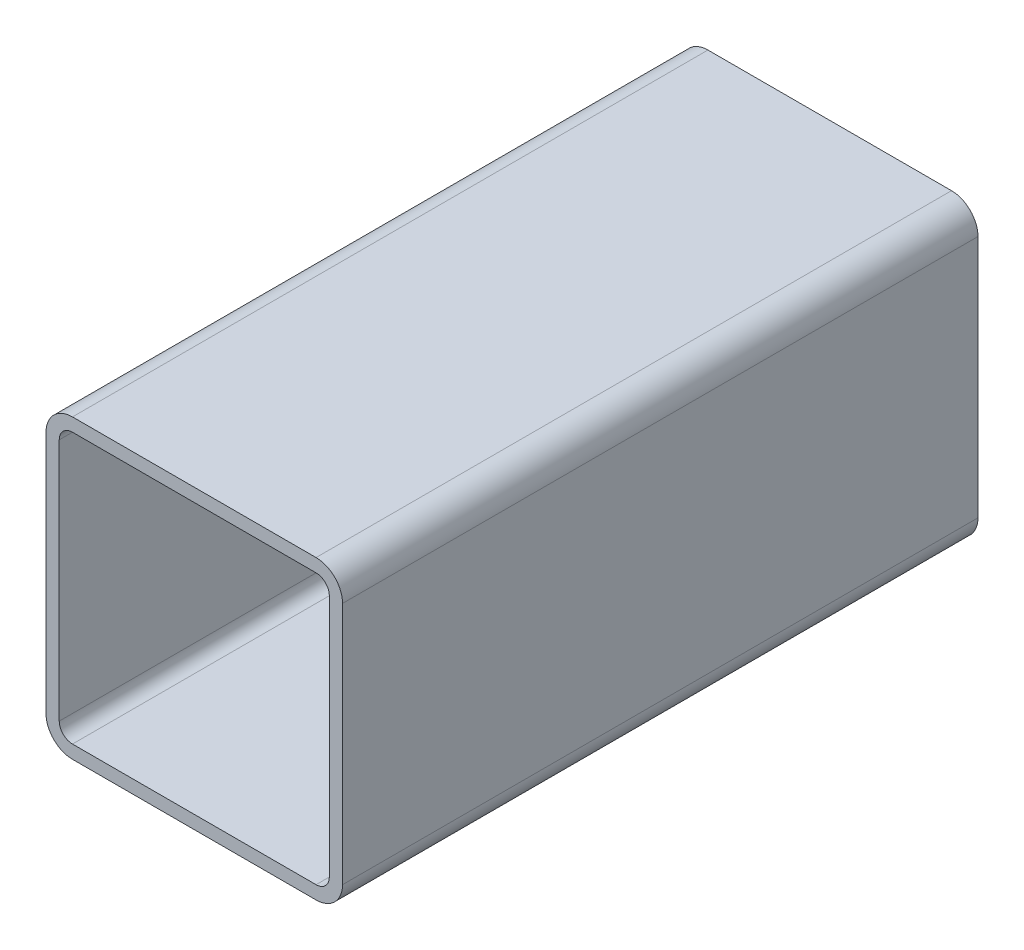
ISO-10303-21;
HEADER;
FILE_DESCRIPTION(('STEP AP214'),'2;1');
FILE_NAME('part.step','',(''),(''),'','','');
FILE_SCHEMA(('AUTOMOTIVE_DESIGN { 1 0 10303 214 1 1 1 1 }'));
ENDSEC;
DATA;
#1=APPLICATION_CONTEXT('core data for automotive mechanical design processes');
#2=APPLICATION_PROTOCOL_DEFINITION('international standard','automotive_design',2000,#1);
#3=PRODUCT_CONTEXT('',#1,'mechanical');
#4=PRODUCT('Part','Part','',(#3));
#5=PRODUCT_RELATED_PRODUCT_CATEGORY('part','',(#4));
#6=PRODUCT_DEFINITION_FORMATION('','',#4);
#7=PRODUCT_DEFINITION_CONTEXT('part definition',#1,'design');
#8=PRODUCT_DEFINITION('design','',#6,#7);
#9=PRODUCT_DEFINITION_SHAPE('','',#8);
#10=(LENGTH_UNIT() NAMED_UNIT(*) SI_UNIT(.MILLI.,.METRE.));
#11=(NAMED_UNIT(*) PLANE_ANGLE_UNIT() SI_UNIT($,.RADIAN.));
#12=(NAMED_UNIT(*) SI_UNIT($,.STERADIAN.) SOLID_ANGLE_UNIT());
#13=UNCERTAINTY_MEASURE_WITH_UNIT(LENGTH_MEASURE(1.E-05),#10,'distance_accuracy_value','');
#14=(GEOMETRIC_REPRESENTATION_CONTEXT(3) GLOBAL_UNCERTAINTY_ASSIGNED_CONTEXT((#13)) GLOBAL_UNIT_ASSIGNED_CONTEXT((#10,
#11,#12)) REPRESENTATION_CONTEXT('',''));
#15=CARTESIAN_POINT('',(0.,0.,0.));
#16=DIRECTION('',(0.,0.,1.));
#17=DIRECTION('',(1.,0.,0.));
#18=AXIS2_PLACEMENT_3D('',#15,#16,#17);
#19=CARTESIAN_POINT('',(6.35000000000004,0.,2070.1));
#20=DIRECTION('',(0.,1.,0.));
#21=DIRECTION('',(0.,0.,1.));
#22=AXIS2_PLACEMENT_3D('',#19,#20,#21);
#23=PLANE('',#22);
#24=DIRECTION('',(0.,0.,-1.));
#25=VECTOR('',#24,1.);
#26=CARTESIAN_POINT('',(6.35000000000004,0.,2070.1));
#27=LINE('',#26,#25);
#28=CARTESIAN_POINT('',(6.35000000000004,0.,2070.1));
#29=VERTEX_POINT('',#28);
#30=CARTESIAN_POINT('',(6.35000000000005,0.,1917.7));
#31=VERTEX_POINT('',#30);
#32=EDGE_CURVE('E42',#29,#31,#27,.T.);
#33=ORIENTED_EDGE('',*,*,#32,.T.);
#34=DIRECTION('',(-1.,0.,0.));
#35=VECTOR('',#34,1.);
#36=CARTESIAN_POINT('',(64.77,0.,1917.7));
#37=LINE('',#36,#35);
#38=CARTESIAN_POINT('',(64.77,0.,1917.7));
#39=VERTEX_POINT('',#38);
#40=EDGE_CURVE('E188',#39,#31,#37,.T.);
#41=ORIENTED_EDGE('',*,*,#40,.F.);
#42=DIRECTION('',(0.,0.,-1.));
#43=VECTOR('',#42,1.);
#44=CARTESIAN_POINT('',(64.77,0.,2070.1));
#45=LINE('',#44,#43);
#46=CARTESIAN_POINT('',(64.77,0.,2070.1));
#47=VERTEX_POINT('',#46);
#48=EDGE_CURVE('E181',#47,#39,#45,.T.);
#49=ORIENTED_EDGE('',*,*,#48,.F.);
#50=DIRECTION('',(1.,0.,0.));
#51=VECTOR('',#50,1.);
#52=CARTESIAN_POINT('',(6.35000000000004,0.,2070.1));
#53=LINE('',#52,#51);
#54=EDGE_CURVE('E189',#29,#47,#53,.T.);
#55=ORIENTED_EDGE('',*,*,#54,.F.);
#56=EDGE_LOOP('',(#33,#41,#49,#55));
#57=FACE_BOUND('',#56,.T.);
#58=ADVANCED_FACE('F34',(#57),#23,.F.);
#59=CARTESIAN_POINT('',(6.35,71.12,2070.1));
#60=DIRECTION('',(0.,-1.,0.));
#61=DIRECTION('',(0.,0.,-1.));
#62=AXIS2_PLACEMENT_3D('',#59,#60,#61);
#63=PLANE('',#62);
#64=DIRECTION('',(0.,0.,-1.));
#65=VECTOR('',#64,1.);
#66=CARTESIAN_POINT('',(64.77,71.12,2070.1));
#67=LINE('',#66,#65);
#68=CARTESIAN_POINT('',(64.77,71.12,2070.1));
#69=VERTEX_POINT('',#68);
#70=CARTESIAN_POINT('',(64.77,71.12,1917.7));
#71=VERTEX_POINT('',#70);
#72=EDGE_CURVE('E168',#69,#71,#67,.T.);
#73=ORIENTED_EDGE('',*,*,#72,.T.);
#74=DIRECTION('',(1.,0.,0.));
#75=VECTOR('',#74,1.);
#76=CARTESIAN_POINT('',(6.35,71.12,1917.7));
#77=LINE('',#76,#75);
#78=CARTESIAN_POINT('',(6.35,71.12,1917.7));
#79=VERTEX_POINT('',#78);
#80=EDGE_CURVE('E162',#79,#71,#77,.T.);
#81=ORIENTED_EDGE('',*,*,#80,.F.);
#82=DIRECTION('',(0.,0.,-1.));
#83=VECTOR('',#82,1.);
#84=CARTESIAN_POINT('',(6.35,71.12,2070.1));
#85=LINE('',#84,#83);
#86=CARTESIAN_POINT('',(6.35,71.12,2070.1));
#87=VERTEX_POINT('',#86);
#88=EDGE_CURVE('E161',#87,#79,#85,.T.);
#89=ORIENTED_EDGE('',*,*,#88,.F.);
#90=DIRECTION('',(-1.,0.,0.));
#91=VECTOR('',#90,1.);
#92=CARTESIAN_POINT('',(6.35,71.12,2070.1));
#93=LINE('',#92,#91);
#94=EDGE_CURVE('E266',#69,#87,#93,.T.);
#95=ORIENTED_EDGE('',*,*,#94,.F.);
#96=EDGE_LOOP('',(#73,#81,#89,#95));
#97=FACE_BOUND('',#96,.T.);
#98=ADVANCED_FACE('F276',(#97),#63,.F.);
#99=CARTESIAN_POINT('',(6.35000000000004,3.175,2070.1));
#100=DIRECTION('',(0.,1.,0.));
#101=DIRECTION('',(0.,0.,1.));
#102=AXIS2_PLACEMENT_3D('',#99,#100,#101);
#103=PLANE('',#102);
#104=DIRECTION('',(1.,0.,0.));
#105=VECTOR('',#104,1.);
#106=CARTESIAN_POINT('',(6.35000000000004,3.175,1917.7));
#107=LINE('',#106,#105);
#108=CARTESIAN_POINT('',(6.35000000000004,3.175,1917.7));
#109=VERTEX_POINT('',#108);
#110=CARTESIAN_POINT('',(64.77,3.175,1917.7));
#111=VERTEX_POINT('',#110);
#112=EDGE_CURVE('E209',#109,#111,#107,.T.);
#113=ORIENTED_EDGE('',*,*,#112,.F.);
#114=DIRECTION('',(0.,0.,-1.));
#115=VECTOR('',#114,1.);
#116=CARTESIAN_POINT('',(6.35000000000004,3.175,2070.1));
#117=LINE('',#116,#115);
#118=CARTESIAN_POINT('',(6.35000000000004,3.175,2070.1));
#119=VERTEX_POINT('',#118);
#120=EDGE_CURVE('E255',#119,#109,#117,.T.);
#121=ORIENTED_EDGE('',*,*,#120,.F.);
#122=DIRECTION('',(1.,0.,0.));
#123=VECTOR('',#122,1.);
#124=CARTESIAN_POINT('',(6.35000000000004,3.175,2070.1));
#125=LINE('',#124,#123);
#126=CARTESIAN_POINT('',(64.77,3.175,2070.1));
#127=VERTEX_POINT('',#126);
#128=EDGE_CURVE('E219',#119,#127,#125,.T.);
#129=ORIENTED_EDGE('',*,*,#128,.T.);
#130=DIRECTION('',(0.,0.,-1.));
#131=VECTOR('',#130,1.);
#132=CARTESIAN_POINT('',(64.77,3.175,2070.1));
#133=LINE('',#132,#131);
#134=EDGE_CURVE('E252',#127,#111,#133,.T.);
#135=ORIENTED_EDGE('',*,*,#134,.T.);
#136=EDGE_LOOP('',(#113,#121,#129,#135));
#137=FACE_BOUND('',#136,.T.);
#138=ADVANCED_FACE('F301',(#137),#103,.T.);
#139=CARTESIAN_POINT('',(6.35,67.945,2070.1));
#140=DIRECTION('',(0.,-1.,0.));
#141=DIRECTION('',(0.,0.,-1.));
#142=AXIS2_PLACEMENT_3D('',#139,#140,#141);
#143=PLANE('',#142);
#144=DIRECTION('',(-1.,0.,0.));
#145=VECTOR('',#144,1.);
#146=CARTESIAN_POINT('',(6.35,67.945,1917.7));
#147=LINE('',#146,#145);
#148=CARTESIAN_POINT('',(64.77,67.945,1917.7));
#149=VERTEX_POINT('',#148);
#150=CARTESIAN_POINT('',(6.35,67.945,1917.7));
#151=VERTEX_POINT('',#150);
#152=EDGE_CURVE('E207',#149,#151,#147,.T.);
#153=ORIENTED_EDGE('',*,*,#152,.F.);
#154=DIRECTION('',(0.,0.,-1.));
#155=VECTOR('',#154,1.);
#156=CARTESIAN_POINT('',(64.77,67.945,2070.1));
#157=LINE('',#156,#155);
#158=CARTESIAN_POINT('',(64.77,67.945,2070.1));
#159=VERTEX_POINT('',#158);
#160=EDGE_CURVE('E243',#159,#149,#157,.T.);
#161=ORIENTED_EDGE('',*,*,#160,.F.);
#162=DIRECTION('',(-1.,0.,0.));
#163=VECTOR('',#162,1.);
#164=CARTESIAN_POINT('',(6.35,67.945,2070.1));
#165=LINE('',#164,#163);
#166=CARTESIAN_POINT('',(6.35,67.945,2070.1));
#167=VERTEX_POINT('',#166);
#168=EDGE_CURVE('E227',#159,#167,#165,.T.);
#169=ORIENTED_EDGE('',*,*,#168,.T.);
#170=DIRECTION('',(0.,0.,-1.));
#171=VECTOR('',#170,1.);
#172=CARTESIAN_POINT('',(6.35,67.945,2070.1));
#173=LINE('',#172,#171);
#174=EDGE_CURVE('E240',#167,#151,#173,.T.);
#175=ORIENTED_EDGE('',*,*,#174,.T.);
#176=EDGE_LOOP('',(#153,#161,#169,#175));
#177=FACE_BOUND('',#176,.T.);
#178=ADVANCED_FACE('F306',(#177),#143,.T.);
#179=CARTESIAN_POINT('',(6.35,6.35,2070.1));
#180=DIRECTION('',(0.,0.,1.));
#181=DIRECTION('',(1.,0.,0.));
#182=AXIS2_PLACEMENT_3D('',#179,#180,#181);
#183=PLANE('',#182);
#184=CARTESIAN_POINT('',(6.35,6.35,2070.1));
#185=DIRECTION('',(0.,0.,1.));
#186=DIRECTION('',(1.,0.,0.));
#187=AXIS2_PLACEMENT_3D('',#184,#185,#186);
#188=CIRCLE('',#187,6.35);
#189=CARTESIAN_POINT('',(0.,6.35000000000004,2070.1));
#190=VERTEX_POINT('',#189);
#191=EDGE_CURVE('E193',#190,#29,#188,.T.);
#192=ORIENTED_EDGE('',*,*,#191,.T.);
#193=ORIENTED_EDGE('',*,*,#54,.T.);
#194=CARTESIAN_POINT('',(64.77,6.35,2070.1));
#195=DIRECTION('',(0.,0.,1.));
#196=DIRECTION('',(1.,0.,0.));
#197=AXIS2_PLACEMENT_3D('',#194,#195,#196);
#198=CIRCLE('',#197,6.35);
#199=CARTESIAN_POINT('',(71.12,6.35,2070.1));
#200=VERTEX_POINT('',#199);
#201=EDGE_CURVE('E260',#47,#200,#198,.T.);
#202=ORIENTED_EDGE('',*,*,#201,.T.);
#203=DIRECTION('',(0.,1.,0.));
#204=VECTOR('',#203,1.);
#205=CARTESIAN_POINT('',(71.12,6.35,2070.1));
#206=LINE('',#205,#204);
#207=CARTESIAN_POINT('',(71.12,64.77,2070.1));
#208=VERTEX_POINT('',#207);
#209=EDGE_CURVE('E262',#200,#208,#206,.T.);
#210=ORIENTED_EDGE('',*,*,#209,.T.);
#211=CARTESIAN_POINT('',(64.77,64.77,2070.1));
#212=DIRECTION('',(0.,0.,1.));
#213=DIRECTION('',(1.,0.,0.));
#214=AXIS2_PLACEMENT_3D('',#211,#212,#213);
#215=CIRCLE('',#214,6.34999999999999);
#216=EDGE_CURVE('E264',#208,#69,#215,.T.);
#217=ORIENTED_EDGE('',*,*,#216,.T.);
#218=ORIENTED_EDGE('',*,*,#94,.T.);
#219=CARTESIAN_POINT('',(6.35,64.77,2070.1));
#220=DIRECTION('',(0.,0.,1.));
#221=DIRECTION('',(1.,0.,0.));
#222=AXIS2_PLACEMENT_3D('',#219,#220,#221);
#223=CIRCLE('',#222,6.35);
#224=CARTESIAN_POINT('',(0.,64.77,2070.1));
#225=VERTEX_POINT('',#224);
#226=EDGE_CURVE('E268',#87,#225,#223,.T.);
#227=ORIENTED_EDGE('',*,*,#226,.T.);
#228=DIRECTION('',(0.,-1.,0.));
#229=VECTOR('',#228,1.);
#230=CARTESIAN_POINT('',(0.,6.35000000000004,2070.1));
#231=LINE('',#230,#229);
#232=EDGE_CURVE('E165',#225,#190,#231,.T.);
#233=ORIENTED_EDGE('',*,*,#232,.T.);
#234=EDGE_LOOP('',(#192,#193,#202,#210,#217,#218,#227,#233));
#235=FACE_BOUND('',#234,.T.);
#236=ORIENTED_EDGE('',*,*,#128,.F.);
#237=CARTESIAN_POINT('',(6.35,6.35,2070.1));
#238=DIRECTION('',(0.,0.,1.));
#239=DIRECTION('',(1.,0.,0.));
#240=AXIS2_PLACEMENT_3D('',#237,#238,#239);
#241=CIRCLE('',#240,3.175);
#242=CARTESIAN_POINT('',(3.175,6.35000000000004,2070.1));
#243=VERTEX_POINT('',#242);
#244=EDGE_CURVE('E217',#243,#119,#241,.T.);
#245=ORIENTED_EDGE('',*,*,#244,.F.);
#246=DIRECTION('',(0.,-1.,0.));
#247=VECTOR('',#246,1.);
#248=CARTESIAN_POINT('',(3.175,6.35000000000004,2070.1));
#249=LINE('',#248,#247);
#250=CARTESIAN_POINT('',(3.175,64.77,2070.1));
#251=VERTEX_POINT('',#250);
#252=EDGE_CURVE('E232',#251,#243,#249,.T.);
#253=ORIENTED_EDGE('',*,*,#252,.F.);
#254=CARTESIAN_POINT('',(6.35,64.77,2070.1));
#255=DIRECTION('',(0.,0.,1.));
#256=DIRECTION('',(1.,0.,0.));
#257=AXIS2_PLACEMENT_3D('',#254,#255,#256);
#258=CIRCLE('',#257,3.175);
#259=EDGE_CURVE('E229',#167,#251,#258,.T.);
#260=ORIENTED_EDGE('',*,*,#259,.F.);
#261=ORIENTED_EDGE('',*,*,#168,.F.);
#262=CARTESIAN_POINT('',(64.77,64.77,2070.1));
#263=DIRECTION('',(0.,0.,1.));
#264=DIRECTION('',(1.,0.,0.));
#265=AXIS2_PLACEMENT_3D('',#262,#263,#264);
#266=CIRCLE('',#265,3.175);
#267=CARTESIAN_POINT('',(67.945,64.77,2070.1));
#268=VERTEX_POINT('',#267);
#269=EDGE_CURVE('E225',#268,#159,#266,.T.);
#270=ORIENTED_EDGE('',*,*,#269,.F.);
#271=DIRECTION('',(0.,1.,0.));
#272=VECTOR('',#271,1.);
#273=CARTESIAN_POINT('',(67.945,6.35,2070.1));
#274=LINE('',#273,#272);
#275=CARTESIAN_POINT('',(67.945,6.35,2070.1));
#276=VERTEX_POINT('',#275);
#277=EDGE_CURVE('E223',#276,#268,#274,.T.);
#278=ORIENTED_EDGE('',*,*,#277,.F.);
#279=CARTESIAN_POINT('',(64.77,6.35,2070.1));
#280=DIRECTION('',(0.,0.,1.));
#281=DIRECTION('',(1.,0.,0.));
#282=AXIS2_PLACEMENT_3D('',#279,#280,#281);
#283=CIRCLE('',#282,3.175);
#284=EDGE_CURVE('E221',#127,#276,#283,.T.);
#285=ORIENTED_EDGE('',*,*,#284,.F.);
#286=EDGE_LOOP('',(#236,#245,#253,#260,#261,#270,#278,#285));
#287=FACE_BOUND('',#286,.T.);
#288=ADVANCED_FACE('F270',(#235,#287),#183,.T.);
#289=CARTESIAN_POINT('',(6.35,6.35,2070.1));
#290=DIRECTION('',(0.,0.,-1.));
#291=DIRECTION('',(-1.,0.,0.));
#292=AXIS2_PLACEMENT_3D('',#289,#290,#291);
#293=CYLINDRICAL_SURFACE('',#292,6.35);
#294=DIRECTION('',(0.,0.,-1.));
#295=VECTOR('',#294,1.);
#296=CARTESIAN_POINT('',(0.,6.35000000000004,2070.1));
#297=LINE('',#296,#295);
#298=CARTESIAN_POINT('',(0.,6.35000000000004,1917.7));
#299=VERTEX_POINT('',#298);
#300=EDGE_CURVE('E166',#190,#299,#297,.T.);
#301=ORIENTED_EDGE('',*,*,#300,.T.);
#302=CARTESIAN_POINT('',(6.35,6.35,1917.7));
#303=DIRECTION('',(0.,0.,1.));
#304=DIRECTION('',(1.,0.,0.));
#305=AXIS2_PLACEMENT_3D('',#302,#303,#304);
#306=CIRCLE('',#305,6.35);
#307=EDGE_CURVE('E49',#31,#299,#306,.F.);
#308=ORIENTED_EDGE('',*,*,#307,.F.);
#309=ORIENTED_EDGE('',*,*,#32,.F.);
#310=ORIENTED_EDGE('',*,*,#191,.F.);
#311=EDGE_LOOP('',(#301,#308,#309,#310));
#312=FACE_BOUND('',#311,.T.);
#313=ADVANCED_FACE('F36',(#312),#293,.T.);
#314=CARTESIAN_POINT('',(64.77,6.35,2070.1));
#315=DIRECTION('',(0.,0.,-1.));
#316=DIRECTION('',(-1.,0.,0.));
#317=AXIS2_PLACEMENT_3D('',#314,#315,#316);
#318=CYLINDRICAL_SURFACE('',#317,6.35);
#319=ORIENTED_EDGE('',*,*,#48,.T.);
#320=CARTESIAN_POINT('',(64.77,6.35,1917.7));
#321=DIRECTION('',(0.,0.,1.));
#322=DIRECTION('',(1.,0.,0.));
#323=AXIS2_PLACEMENT_3D('',#320,#321,#322);
#324=CIRCLE('',#323,6.35);
#325=CARTESIAN_POINT('',(71.12,6.35,1917.7));
#326=VERTEX_POINT('',#325);
#327=EDGE_CURVE('E197',#326,#39,#324,.F.);
#328=ORIENTED_EDGE('',*,*,#327,.F.);
#329=DIRECTION('',(0.,0.,-1.));
#330=VECTOR('',#329,1.);
#331=CARTESIAN_POINT('',(71.12,6.35,2070.1));
#332=LINE('',#331,#330);
#333=EDGE_CURVE('E178',#200,#326,#332,.T.);
#334=ORIENTED_EDGE('',*,*,#333,.F.);
#335=ORIENTED_EDGE('',*,*,#201,.F.);
#336=EDGE_LOOP('',(#319,#328,#334,#335));
#337=FACE_BOUND('',#336,.T.);
#338=ADVANCED_FACE('F288',(#337),#318,.T.);
#339=CARTESIAN_POINT('',(71.12,6.35,2070.1));
#340=DIRECTION('',(-1.,0.,0.));
#341=DIRECTION('',(0.,0.,1.));
#342=AXIS2_PLACEMENT_3D('',#339,#340,#341);
#343=PLANE('',#342);
#344=ORIENTED_EDGE('',*,*,#333,.T.);
#345=DIRECTION('',(0.,-1.,0.));
#346=VECTOR('',#345,1.);
#347=CARTESIAN_POINT('',(71.12,64.77,1917.7));
#348=LINE('',#347,#346);
#349=CARTESIAN_POINT('',(71.12,64.77,1917.7));
#350=VERTEX_POINT('',#349);
#351=EDGE_CURVE('E201',#350,#326,#348,.T.);
#352=ORIENTED_EDGE('',*,*,#351,.F.);
#353=DIRECTION('',(0.,0.,-1.));
#354=VECTOR('',#353,1.);
#355=CARTESIAN_POINT('',(71.12,64.77,2070.1));
#356=LINE('',#355,#354);
#357=EDGE_CURVE('E175',#208,#350,#356,.T.);
#358=ORIENTED_EDGE('',*,*,#357,.F.);
#359=ORIENTED_EDGE('',*,*,#209,.F.);
#360=EDGE_LOOP('',(#344,#352,#358,#359));
#361=FACE_BOUND('',#360,.T.);
#362=ADVANCED_FACE('F284',(#361),#343,.F.);
#363=CARTESIAN_POINT('',(64.77,64.77,2070.1));
#364=DIRECTION('',(0.,0.,-1.));
#365=DIRECTION('',(-1.,0.,0.));
#366=AXIS2_PLACEMENT_3D('',#363,#364,#365);
#367=CYLINDRICAL_SURFACE('',#366,6.34999999999999);
#368=ORIENTED_EDGE('',*,*,#357,.T.);
#369=CARTESIAN_POINT('',(64.77,64.77,1917.7));
#370=DIRECTION('',(0.,0.,1.));
#371=DIRECTION('',(1.,0.,0.));
#372=AXIS2_PLACEMENT_3D('',#369,#370,#371);
#373=CIRCLE('',#372,6.34999999999999);
#374=EDGE_CURVE('E203',#71,#350,#373,.F.);
#375=ORIENTED_EDGE('',*,*,#374,.F.);
#376=ORIENTED_EDGE('',*,*,#72,.F.);
#377=ORIENTED_EDGE('',*,*,#216,.F.);
#378=EDGE_LOOP('',(#368,#375,#376,#377));
#379=FACE_BOUND('',#378,.T.);
#380=ADVANCED_FACE('F280',(#379),#367,.T.);
#381=CARTESIAN_POINT('',(6.35,64.77,2070.1));
#382=DIRECTION('',(0.,0.,-1.));
#383=DIRECTION('',(-1.,0.,0.));
#384=AXIS2_PLACEMENT_3D('',#381,#382,#383);
#385=CYLINDRICAL_SURFACE('',#384,6.35);
#386=ORIENTED_EDGE('',*,*,#88,.T.);
#387=CARTESIAN_POINT('',(6.35,64.77,1917.7));
#388=DIRECTION('',(0.,0.,1.));
#389=DIRECTION('',(1.,0.,0.));
#390=AXIS2_PLACEMENT_3D('',#387,#388,#389);
#391=CIRCLE('',#390,6.35);
#392=CARTESIAN_POINT('',(0.,64.77,1917.7));
#393=VERTEX_POINT('',#392);
#394=EDGE_CURVE('E146',#393,#79,#391,.F.);
#395=ORIENTED_EDGE('',*,*,#394,.F.);
#396=DIRECTION('',(0.,0.,-1.));
#397=VECTOR('',#396,1.);
#398=CARTESIAN_POINT('',(0.,64.77,2070.1));
#399=LINE('',#398,#397);
#400=EDGE_CURVE('E158',#225,#393,#399,.T.);
#401=ORIENTED_EDGE('',*,*,#400,.F.);
#402=ORIENTED_EDGE('',*,*,#226,.F.);
#403=EDGE_LOOP('',(#386,#395,#401,#402));
#404=FACE_BOUND('',#403,.T.);
#405=ADVANCED_FACE('F156',(#404),#385,.T.);
#406=CARTESIAN_POINT('',(0.,6.35000000000004,2070.1));
#407=DIRECTION('',(1.,0.,0.));
#408=DIRECTION('',(0.,0.,-1.));
#409=AXIS2_PLACEMENT_3D('',#406,#407,#408);
#410=PLANE('',#409);
#411=ORIENTED_EDGE('',*,*,#400,.T.);
#412=DIRECTION('',(0.,1.,0.));
#413=VECTOR('',#412,1.);
#414=CARTESIAN_POINT('',(0.,6.35000000000004,1917.7));
#415=LINE('',#414,#413);
#416=EDGE_CURVE('E143',#299,#393,#415,.T.);
#417=ORIENTED_EDGE('',*,*,#416,.F.);
#418=ORIENTED_EDGE('',*,*,#300,.F.);
#419=ORIENTED_EDGE('',*,*,#232,.F.);
#420=EDGE_LOOP('',(#411,#417,#418,#419));
#421=FACE_BOUND('',#420,.T.);
#422=ADVANCED_FACE('F164',(#421),#410,.F.);
#423=CARTESIAN_POINT('',(6.35,6.35,2070.1));
#424=DIRECTION('',(0.,0.,-1.));
#425=DIRECTION('',(-1.,0.,0.));
#426=AXIS2_PLACEMENT_3D('',#423,#424,#425);
#427=CYLINDRICAL_SURFACE('',#426,3.175);
#428=CARTESIAN_POINT('',(6.35,6.35,1917.7));
#429=DIRECTION('',(0.,0.,1.));
#430=DIRECTION('',(1.,0.,0.));
#431=AXIS2_PLACEMENT_3D('',#428,#429,#430);
#432=CIRCLE('',#431,3.175);
#433=CARTESIAN_POINT('',(3.175,6.35000000000004,1917.7));
#434=VERTEX_POINT('',#433);
#435=EDGE_CURVE('E195',#434,#109,#432,.T.);
#436=ORIENTED_EDGE('',*,*,#435,.F.);
#437=DIRECTION('',(0.,0.,-1.));
#438=VECTOR('',#437,1.);
#439=CARTESIAN_POINT('',(3.175,6.35000000000004,2070.1));
#440=LINE('',#439,#438);
#441=EDGE_CURVE('E234',#243,#434,#440,.T.);
#442=ORIENTED_EDGE('',*,*,#441,.F.);
#443=ORIENTED_EDGE('',*,*,#244,.T.);
#444=ORIENTED_EDGE('',*,*,#120,.T.);
#445=EDGE_LOOP('',(#436,#442,#443,#444));
#446=FACE_BOUND('',#445,.T.);
#447=ADVANCED_FACE('F319',(#446),#427,.F.);
#448=CARTESIAN_POINT('',(64.77,6.35,2070.1));
#449=DIRECTION('',(0.,0.,-1.));
#450=DIRECTION('',(-1.,0.,0.));
#451=AXIS2_PLACEMENT_3D('',#448,#449,#450);
#452=CYLINDRICAL_SURFACE('',#451,3.175);
#453=CARTESIAN_POINT('',(64.77,6.35,1917.7));
#454=DIRECTION('',(0.,0.,1.));
#455=DIRECTION('',(1.,0.,0.));
#456=AXIS2_PLACEMENT_3D('',#453,#454,#455);
#457=CIRCLE('',#456,3.175);
#458=CARTESIAN_POINT('',(67.945,6.35,1917.7));
#459=VERTEX_POINT('',#458);
#460=EDGE_CURVE('E215',#111,#459,#457,.T.);
#461=ORIENTED_EDGE('',*,*,#460,.F.);
#462=ORIENTED_EDGE('',*,*,#134,.F.);
#463=ORIENTED_EDGE('',*,*,#284,.T.);
#464=DIRECTION('',(0.,0.,-1.));
#465=VECTOR('',#464,1.);
#466=CARTESIAN_POINT('',(67.945,6.35,2070.1));
#467=LINE('',#466,#465);
#468=EDGE_CURVE('E249',#276,#459,#467,.T.);
#469=ORIENTED_EDGE('',*,*,#468,.T.);
#470=EDGE_LOOP('',(#461,#462,#463,#469));
#471=FACE_BOUND('',#470,.T.);
#472=ADVANCED_FACE('F323',(#471),#452,.F.);
#473=CARTESIAN_POINT('',(67.945,6.35,2070.1));
#474=DIRECTION('',(-1.,0.,0.));
#475=DIRECTION('',(0.,0.,1.));
#476=AXIS2_PLACEMENT_3D('',#473,#474,#475);
#477=PLANE('',#476);
#478=DIRECTION('',(0.,1.,0.));
#479=VECTOR('',#478,1.);
#480=CARTESIAN_POINT('',(67.945,6.35,1917.7));
#481=LINE('',#480,#479);
#482=CARTESIAN_POINT('',(67.945,64.77,1917.7));
#483=VERTEX_POINT('',#482);
#484=EDGE_CURVE('E213',#459,#483,#481,.T.);
#485=ORIENTED_EDGE('',*,*,#484,.F.);
#486=ORIENTED_EDGE('',*,*,#468,.F.);
#487=ORIENTED_EDGE('',*,*,#277,.T.);
#488=DIRECTION('',(0.,0.,-1.));
#489=VECTOR('',#488,1.);
#490=CARTESIAN_POINT('',(67.945,64.77,2070.1));
#491=LINE('',#490,#489);
#492=EDGE_CURVE('E246',#268,#483,#491,.T.);
#493=ORIENTED_EDGE('',*,*,#492,.T.);
#494=EDGE_LOOP('',(#485,#486,#487,#493));
#495=FACE_BOUND('',#494,.T.);
#496=ADVANCED_FACE('F331',(#495),#477,.T.);
#497=CARTESIAN_POINT('',(64.77,64.77,2070.1));
#498=DIRECTION('',(0.,0.,-1.));
#499=DIRECTION('',(-1.,0.,0.));
#500=AXIS2_PLACEMENT_3D('',#497,#498,#499);
#501=CYLINDRICAL_SURFACE('',#500,3.175);
#502=CARTESIAN_POINT('',(64.77,64.77,1917.7));
#503=DIRECTION('',(0.,0.,1.));
#504=DIRECTION('',(1.,0.,0.));
#505=AXIS2_PLACEMENT_3D('',#502,#503,#504);
#506=CIRCLE('',#505,3.175);
#507=EDGE_CURVE('E211',#483,#149,#506,.T.);
#508=ORIENTED_EDGE('',*,*,#507,.F.);
#509=ORIENTED_EDGE('',*,*,#492,.F.);
#510=ORIENTED_EDGE('',*,*,#269,.T.);
#511=ORIENTED_EDGE('',*,*,#160,.T.);
#512=EDGE_LOOP('',(#508,#509,#510,#511));
#513=FACE_BOUND('',#512,.T.);
#514=ADVANCED_FACE('F335',(#513),#501,.F.);
#515=CARTESIAN_POINT('',(6.35,64.77,2070.1));
#516=DIRECTION('',(0.,0.,-1.));
#517=DIRECTION('',(-1.,0.,0.));
#518=AXIS2_PLACEMENT_3D('',#515,#516,#517);
#519=CYLINDRICAL_SURFACE('',#518,3.175);
#520=CARTESIAN_POINT('',(6.35,64.77,1917.7));
#521=DIRECTION('',(0.,0.,1.));
#522=DIRECTION('',(1.,0.,0.));
#523=AXIS2_PLACEMENT_3D('',#520,#521,#522);
#524=CIRCLE('',#523,3.175);
#525=CARTESIAN_POINT('',(3.175,64.77,1917.7));
#526=VERTEX_POINT('',#525);
#527=EDGE_CURVE('E56',#151,#526,#524,.T.);
#528=ORIENTED_EDGE('',*,*,#527,.F.);
#529=ORIENTED_EDGE('',*,*,#174,.F.);
#530=ORIENTED_EDGE('',*,*,#259,.T.);
#531=DIRECTION('',(0.,0.,-1.));
#532=VECTOR('',#531,1.);
#533=CARTESIAN_POINT('',(3.175,64.77,2070.1));
#534=LINE('',#533,#532);
#535=EDGE_CURVE('E237',#251,#526,#534,.T.);
#536=ORIENTED_EDGE('',*,*,#535,.T.);
#537=EDGE_LOOP('',(#528,#529,#530,#536));
#538=FACE_BOUND('',#537,.T.);
#539=ADVANCED_FACE('F339',(#538),#519,.F.);
#540=CARTESIAN_POINT('',(3.175,6.35000000000004,2070.1));
#541=DIRECTION('',(1.,0.,0.));
#542=DIRECTION('',(0.,0.,-1.));
#543=AXIS2_PLACEMENT_3D('',#540,#541,#542);
#544=PLANE('',#543);
#545=DIRECTION('',(0.,-1.,0.));
#546=VECTOR('',#545,1.);
#547=CARTESIAN_POINT('',(3.175,6.35000000000004,1917.7));
#548=LINE('',#547,#546);
#549=EDGE_CURVE('E12',#526,#434,#548,.T.);
#550=ORIENTED_EDGE('',*,*,#549,.F.);
#551=ORIENTED_EDGE('',*,*,#535,.F.);
#552=ORIENTED_EDGE('',*,*,#252,.T.);
#553=ORIENTED_EDGE('',*,*,#441,.T.);
#554=EDGE_LOOP('',(#550,#551,#552,#553));
#555=FACE_BOUND('',#554,.T.);
#556=ADVANCED_FACE('F346',(#555),#544,.T.);
#557=CARTESIAN_POINT('',(6.35,6.35,1917.7));
#558=DIRECTION('',(0.,0.,1.));
#559=DIRECTION('',(1.,0.,0.));
#560=AXIS2_PLACEMENT_3D('',#557,#558,#559);
#561=PLANE('',#560);
#562=ORIENTED_EDGE('',*,*,#460,.T.);
#563=ORIENTED_EDGE('',*,*,#484,.T.);
#564=ORIENTED_EDGE('',*,*,#507,.T.);
#565=ORIENTED_EDGE('',*,*,#152,.T.);
#566=ORIENTED_EDGE('',*,*,#527,.T.);
#567=ORIENTED_EDGE('',*,*,#549,.T.);
#568=ORIENTED_EDGE('',*,*,#435,.T.);
#569=ORIENTED_EDGE('',*,*,#112,.T.);
#570=EDGE_LOOP('',(#562,#563,#564,#565,#566,#567,#568,#569));
#571=FACE_BOUND('',#570,.T.);
#572=ORIENTED_EDGE('',*,*,#307,.T.);
#573=ORIENTED_EDGE('',*,*,#416,.T.);
#574=ORIENTED_EDGE('',*,*,#394,.T.);
#575=ORIENTED_EDGE('',*,*,#80,.T.);
#576=ORIENTED_EDGE('',*,*,#374,.T.);
#577=ORIENTED_EDGE('',*,*,#351,.T.);
#578=ORIENTED_EDGE('',*,*,#327,.T.);
#579=ORIENTED_EDGE('',*,*,#40,.T.);
#580=EDGE_LOOP('',(#572,#573,#574,#575,#576,#577,#578,#579));
#581=FACE_BOUND('',#580,.T.);
#582=ADVANCED_FACE('F145',(#571,#581),#561,.F.);
#583=CLOSED_SHELL('',(#58,#98,#138,#178,#288,#313,#338,#362,#380,#405,#422,#447,#472,#496,#514,
#539,#556,#582));
#584=MANIFOLD_SOLID_BREP('B2',#583);
#585=ADVANCED_BREP_SHAPE_REPRESENTATION('',(#18,#584),#14);
#586=SHAPE_DEFINITION_REPRESENTATION(#9,#585);
ENDSEC;
END-ISO-10303-21;
